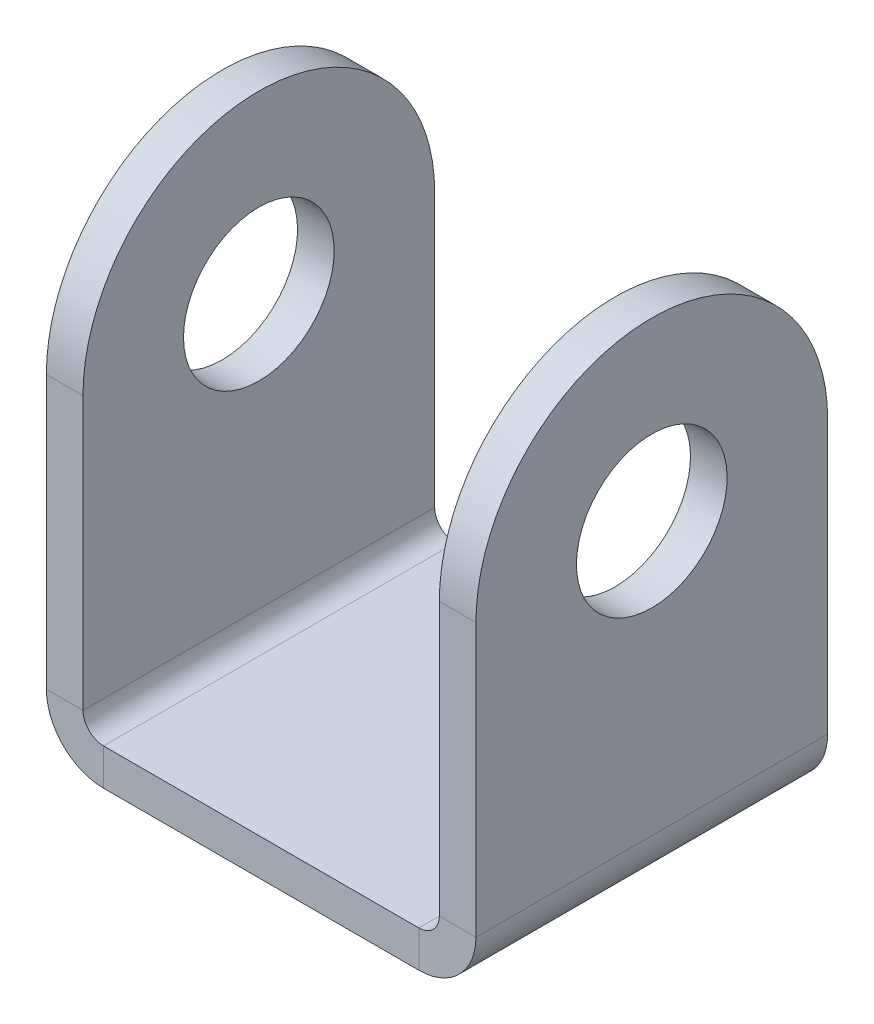
ISO-10303-21;
HEADER;
FILE_DESCRIPTION(('STEP AP214'),'2;1');
FILE_NAME('part.step','',(''),(''),'','','');
FILE_SCHEMA(('AUTOMOTIVE_DESIGN { 1 0 10303 214 1 1 1 1 }'));
ENDSEC;
DATA;
#1=APPLICATION_CONTEXT('core data for automotive mechanical design processes');
#2=APPLICATION_PROTOCOL_DEFINITION('international standard','automotive_design',2000,#1);
#3=PRODUCT_CONTEXT('',#1,'mechanical');
#4=PRODUCT('Part','Part','',(#3));
#5=PRODUCT_RELATED_PRODUCT_CATEGORY('part','',(#4));
#6=PRODUCT_DEFINITION_FORMATION('','',#4);
#7=PRODUCT_DEFINITION_CONTEXT('part definition',#1,'design');
#8=PRODUCT_DEFINITION('design','',#6,#7);
#9=PRODUCT_DEFINITION_SHAPE('','',#8);
#10=(LENGTH_UNIT() NAMED_UNIT(*) SI_UNIT(.MILLI.,.METRE.));
#11=(NAMED_UNIT(*) PLANE_ANGLE_UNIT() SI_UNIT($,.RADIAN.));
#12=(NAMED_UNIT(*) SI_UNIT($,.STERADIAN.) SOLID_ANGLE_UNIT());
#13=UNCERTAINTY_MEASURE_WITH_UNIT(LENGTH_MEASURE(1.E-05),#10,'distance_accuracy_value','');
#14=(GEOMETRIC_REPRESENTATION_CONTEXT(3) GLOBAL_UNCERTAINTY_ASSIGNED_CONTEXT((#13)) GLOBAL_UNIT_ASSIGNED_CONTEXT((#10,
#11,#12)) REPRESENTATION_CONTEXT('',''));
#15=CARTESIAN_POINT('',(0.,0.,0.));
#16=DIRECTION('',(0.,0.,1.));
#17=DIRECTION('',(1.,0.,0.));
#18=AXIS2_PLACEMENT_3D('',#15,#16,#17);
#19=CARTESIAN_POINT('',(-9.3075,0.,0.));
#20=DIRECTION('',(1.,0.,0.));
#21=DIRECTION('',(0.,1.,0.));
#22=AXIS2_PLACEMENT_3D('',#19,#20,#21);
#23=PLANE('',#22);
#24=CARTESIAN_POINT('',(-9.30750000000004,12.7,0.));
#25=DIRECTION('',(-1.,0.,0.));
#26=DIRECTION('',(0.,-1.,0.));
#27=AXIS2_PLACEMENT_3D('',#24,#25,#26);
#28=CIRCLE('',#27,3.2639);
#29=CARTESIAN_POINT('',(-9.30750000000003,9.4361,0.));
#30=VERTEX_POINT('',#29);
#31=EDGE_CURVE('E313',#30,#30,#28,.T.);
#32=ORIENTED_EDGE('',*,*,#31,.F.);
#33=EDGE_LOOP('',(#32));
#34=FACE_BOUND('',#33,.T.);
#35=DIRECTION('',(0.,1.,0.));
#36=VECTOR('',#35,1.);
#37=CARTESIAN_POINT('',(-9.3075,0.,7.61999999999999));
#38=LINE('',#37,#36);
#39=CARTESIAN_POINT('',(-9.3075,0.888999999999992,7.61999999999999));
#40=VERTEX_POINT('',#39);
#41=CARTESIAN_POINT('',(-9.30750000000004,12.7,7.61999999999999));
#42=VERTEX_POINT('',#41);
#43=EDGE_CURVE('E192',#40,#42,#38,.T.);
#44=ORIENTED_EDGE('',*,*,#43,.T.);
#45=CARTESIAN_POINT('',(-9.30750000000004,12.7,0.));
#46=DIRECTION('',(-1.,0.,0.));
#47=DIRECTION('',(0.,-1.,0.));
#48=AXIS2_PLACEMENT_3D('',#45,#46,#47);
#49=CIRCLE('',#48,7.62);
#50=CARTESIAN_POINT('',(-9.30750000000004,12.7,-7.62));
#51=VERTEX_POINT('',#50);
#52=EDGE_CURVE('E176',#51,#42,#49,.F.);
#53=ORIENTED_EDGE('',*,*,#52,.F.);
#54=DIRECTION('',(0.,-1.,0.));
#55=VECTOR('',#54,1.);
#56=CARTESIAN_POINT('',(-9.3075,0.,-7.62));
#57=LINE('',#56,#55);
#58=CARTESIAN_POINT('',(-9.3075,0.888999999999991,-7.62));
#59=VERTEX_POINT('',#58);
#60=EDGE_CURVE('E201',#51,#59,#57,.T.);
#61=ORIENTED_EDGE('',*,*,#60,.T.);
#62=DIRECTION('',(0.,0.,1.));
#63=VECTOR('',#62,1.);
#64=CARTESIAN_POINT('',(-9.3075,0.888999999999991,-7.62));
#65=LINE('',#64,#63);
#66=EDGE_CURVE('E199',#40,#59,#65,.F.);
#67=ORIENTED_EDGE('',*,*,#66,.F.);
#68=EDGE_LOOP('',(#44,#53,#61,#67));
#69=FACE_BOUND('',#68,.T.);
#70=ADVANCED_FACE('F84',(#34,#69),#23,.F.);
#71=CARTESIAN_POINT('',(-7.72,0.,0.));
#72=DIRECTION('',(1.,0.,0.));
#73=DIRECTION('',(0.,1.,0.));
#74=AXIS2_PLACEMENT_3D('',#71,#72,#73);
#75=PLANE('',#74);
#76=CARTESIAN_POINT('',(-7.72000000000004,12.7,0.));
#77=DIRECTION('',(1.,0.,0.));
#78=DIRECTION('',(0.,1.,0.));
#79=AXIS2_PLACEMENT_3D('',#76,#77,#78);
#80=CIRCLE('',#79,3.2639);
#81=CARTESIAN_POINT('',(-7.72000000000005,15.9639,0.));
#82=VERTEX_POINT('',#81);
#83=EDGE_CURVE('E195',#82,#82,#80,.T.);
#84=ORIENTED_EDGE('',*,*,#83,.F.);
#85=EDGE_LOOP('',(#84));
#86=FACE_BOUND('',#85,.T.);
#87=CARTESIAN_POINT('',(-7.72000000000004,12.7,0.));
#88=DIRECTION('',(1.,0.,0.));
#89=DIRECTION('',(0.,1.,0.));
#90=AXIS2_PLACEMENT_3D('',#87,#88,#89);
#91=CIRCLE('',#90,7.62);
#92=CARTESIAN_POINT('',(-7.72000000000004,12.7,7.61999999999999));
#93=VERTEX_POINT('',#92);
#94=CARTESIAN_POINT('',(-7.72000000000007,12.7,-7.62));
#95=VERTEX_POINT('',#94);
#96=EDGE_CURVE('E283',#93,#95,#91,.F.);
#97=ORIENTED_EDGE('',*,*,#96,.F.);
#98=DIRECTION('',(0.,-1.,0.));
#99=VECTOR('',#98,1.);
#100=CARTESIAN_POINT('',(-7.72000000000007,20.32,7.61999999999999));
#101=LINE('',#100,#99);
#102=CARTESIAN_POINT('',(-7.72,0.888999999999997,7.61999999999999));
#103=VERTEX_POINT('',#102);
#104=EDGE_CURVE('E194',#103,#93,#101,.F.);
#105=ORIENTED_EDGE('',*,*,#104,.F.);
#106=DIRECTION('',(0.,0.,1.));
#107=VECTOR('',#106,1.);
#108=CARTESIAN_POINT('',(-7.72,0.888999999999997,-7.62));
#109=LINE('',#108,#107);
#110=CARTESIAN_POINT('',(-7.72,0.888999999999996,-7.62));
#111=VERTEX_POINT('',#110);
#112=EDGE_CURVE('E217',#111,#103,#109,.T.);
#113=ORIENTED_EDGE('',*,*,#112,.F.);
#114=DIRECTION('',(0.,1.,0.));
#115=VECTOR('',#114,1.);
#116=CARTESIAN_POINT('',(-7.72,0.,-7.62));
#117=LINE('',#116,#115);
#118=EDGE_CURVE('E211',#95,#111,#117,.F.);
#119=ORIENTED_EDGE('',*,*,#118,.F.);
#120=EDGE_LOOP('',(#97,#105,#113,#119));
#121=FACE_BOUND('',#120,.T.);
#122=ADVANCED_FACE('F320',(#86,#121),#75,.T.);
#123=CARTESIAN_POINT('',(9.3075,0.,0.));
#124=DIRECTION('',(-1.,0.,0.));
#125=DIRECTION('',(0.,-1.,0.));
#126=AXIS2_PLACEMENT_3D('',#123,#124,#125);
#127=PLANE('',#126);
#128=CARTESIAN_POINT('',(9.30750000000004,12.7000000000001,0.));
#129=DIRECTION('',(-1.,0.,0.));
#130=DIRECTION('',(0.,-1.,0.));
#131=AXIS2_PLACEMENT_3D('',#128,#129,#130);
#132=CIRCLE('',#131,3.2639);
#133=CARTESIAN_POINT('',(9.30750000000003,9.43610000000007,0.));
#134=VERTEX_POINT('',#133);
#135=EDGE_CURVE('E310',#134,#134,#132,.F.);
#136=ORIENTED_EDGE('',*,*,#135,.F.);
#137=EDGE_LOOP('',(#136));
#138=FACE_BOUND('',#137,.T.);
#139=CARTESIAN_POINT('',(9.30750000000004,12.7000000000001,0.));
#140=DIRECTION('',(-1.,0.,0.));
#141=DIRECTION('',(0.,-1.,0.));
#142=AXIS2_PLACEMENT_3D('',#139,#140,#141);
#143=CIRCLE('',#142,7.62);
#144=CARTESIAN_POINT('',(9.30750000000002,12.7000000000001,7.61999999999999));
#145=VERTEX_POINT('',#144);
#146=CARTESIAN_POINT('',(9.30750000000004,12.7000000000001,-7.62));
#147=VERTEX_POINT('',#146);
#148=EDGE_CURVE('E303',#145,#147,#143,.T.);
#149=ORIENTED_EDGE('',*,*,#148,.F.);
#150=DIRECTION('',(0.,-1.,0.));
#151=VECTOR('',#150,1.);
#152=CARTESIAN_POINT('',(9.3075,0.,7.61999999999999));
#153=LINE('',#152,#151);
#154=CARTESIAN_POINT('',(9.3075,0.888999999999991,7.61999999999999));
#155=VERTEX_POINT('',#154);
#156=EDGE_CURVE('E296',#145,#155,#153,.T.);
#157=ORIENTED_EDGE('',*,*,#156,.T.);
#158=DIRECTION('',(0.,0.,-1.));
#159=VECTOR('',#158,1.);
#160=CARTESIAN_POINT('',(9.3075,0.888999999999991,7.61999999999999));
#161=LINE('',#160,#159);
#162=CARTESIAN_POINT('',(9.3075,0.888999999999991,-7.62));
#163=VERTEX_POINT('',#162);
#164=EDGE_CURVE('E288',#163,#155,#161,.F.);
#165=ORIENTED_EDGE('',*,*,#164,.F.);
#166=DIRECTION('',(0.,1.,0.));
#167=VECTOR('',#166,1.);
#168=CARTESIAN_POINT('',(9.3075,0.,-7.62));
#169=LINE('',#168,#167);
#170=EDGE_CURVE('E275',#163,#147,#169,.T.);
#171=ORIENTED_EDGE('',*,*,#170,.T.);
#172=EDGE_LOOP('',(#149,#157,#165,#171));
#173=FACE_BOUND('',#172,.T.);
#174=ADVANCED_FACE('F326',(#138,#173),#127,.F.);
#175=CARTESIAN_POINT('',(7.72,0.,0.));
#176=DIRECTION('',(-1.,0.,0.));
#177=DIRECTION('',(0.,-1.,0.));
#178=AXIS2_PLACEMENT_3D('',#175,#176,#177);
#179=PLANE('',#178);
#180=CARTESIAN_POINT('',(7.72000000000004,12.7000000000001,0.));
#181=DIRECTION('',(-1.,0.,0.));
#182=DIRECTION('',(0.,-1.,0.));
#183=AXIS2_PLACEMENT_3D('',#180,#181,#182);
#184=CIRCLE('',#183,3.2639);
#185=CARTESIAN_POINT('',(7.72000000000003,9.43610000000006,0.));
#186=VERTEX_POINT('',#185);
#187=EDGE_CURVE('E88',#186,#186,#184,.T.);
#188=ORIENTED_EDGE('',*,*,#187,.F.);
#189=EDGE_LOOP('',(#188));
#190=FACE_BOUND('',#189,.T.);
#191=DIRECTION('',(0.,1.,0.));
#192=VECTOR('',#191,1.);
#193=CARTESIAN_POINT('',(7.72,0.,7.61999999999999));
#194=LINE('',#193,#192);
#195=CARTESIAN_POINT('',(7.72000000000004,12.7000000000001,7.61999999999999));
#196=VERTEX_POINT('',#195);
#197=CARTESIAN_POINT('',(7.72,0.888999999999997,7.61999999999999));
#198=VERTEX_POINT('',#197);
#199=EDGE_CURVE('E291',#196,#198,#194,.F.);
#200=ORIENTED_EDGE('',*,*,#199,.F.);
#201=CARTESIAN_POINT('',(7.72000000000004,12.7000000000001,0.));
#202=DIRECTION('',(-1.,0.,0.));
#203=DIRECTION('',(0.,-1.,0.));
#204=AXIS2_PLACEMENT_3D('',#201,#202,#203);
#205=CIRCLE('',#204,7.62);
#206=CARTESIAN_POINT('',(7.72000000000002,12.7000000000001,-7.62));
#207=VERTEX_POINT('',#206);
#208=EDGE_CURVE('E301',#207,#196,#205,.F.);
#209=ORIENTED_EDGE('',*,*,#208,.F.);
#210=DIRECTION('',(0.,-1.,0.));
#211=VECTOR('',#210,1.);
#212=CARTESIAN_POINT('',(7.72000000000007,20.32,-7.62));
#213=LINE('',#212,#211);
#214=CARTESIAN_POINT('',(7.72,0.888999999999997,-7.62));
#215=VERTEX_POINT('',#214);
#216=EDGE_CURVE('E293',#215,#207,#213,.F.);
#217=ORIENTED_EDGE('',*,*,#216,.F.);
#218=DIRECTION('',(0.,0.,-1.));
#219=VECTOR('',#218,1.);
#220=CARTESIAN_POINT('',(7.72,0.888999999999997,7.61999999999999));
#221=LINE('',#220,#219);
#222=EDGE_CURVE('E282',#198,#215,#221,.T.);
#223=ORIENTED_EDGE('',*,*,#222,.F.);
#224=EDGE_LOOP('',(#200,#209,#217,#223));
#225=FACE_BOUND('',#224,.T.);
#226=ADVANCED_FACE('F336',(#190,#225),#179,.T.);
#227=CARTESIAN_POINT('',(-9.30750000000007,20.32,7.61999999999999));
#228=DIRECTION('',(0.,0.,-1.));
#229=DIRECTION('',(-1.,0.,0.));
#230=AXIS2_PLACEMENT_3D('',#227,#228,#229);
#231=PLANE('',#230);
#232=DIRECTION('',(-1.,0.,0.));
#233=VECTOR('',#232,1.);
#234=CARTESIAN_POINT('',(20.083807345283,12.7000000000001,7.61999999999999));
#235=LINE('',#234,#233);
#236=EDGE_CURVE('E179',#93,#42,#235,.T.);
#237=ORIENTED_EDGE('',*,*,#236,.T.);
#238=ORIENTED_EDGE('',*,*,#43,.F.);
#239=DIRECTION('',(1.,0.,0.));
#240=VECTOR('',#239,1.);
#241=CARTESIAN_POINT('',(-7.72,0.888999999999997,7.61999999999999));
#242=LINE('',#241,#240);
#243=EDGE_CURVE('E214',#103,#40,#242,.F.);
#244=ORIENTED_EDGE('',*,*,#243,.F.);
#245=ORIENTED_EDGE('',*,*,#104,.T.);
#246=EDGE_LOOP('',(#237,#238,#244,#245));
#247=FACE_BOUND('',#246,.T.);
#248=ADVANCED_FACE('F190',(#247),#231,.F.);
#249=CARTESIAN_POINT('',(9.3075,0.,7.61999999999999));
#250=DIRECTION('',(0.,0.,-1.));
#251=DIRECTION('',(-1.,0.,0.));
#252=AXIS2_PLACEMENT_3D('',#249,#250,#251);
#253=PLANE('',#252);
#254=EDGE_CURVE('E186',#145,#196,#235,.T.);
#255=ORIENTED_EDGE('',*,*,#254,.T.);
#256=ORIENTED_EDGE('',*,*,#199,.T.);
#257=DIRECTION('',(-1.,0.,0.));
#258=VECTOR('',#257,1.);
#259=CARTESIAN_POINT('',(9.3075,0.888999999999991,7.61999999999999));
#260=LINE('',#259,#258);
#261=EDGE_CURVE('E267',#198,#155,#260,.F.);
#262=ORIENTED_EDGE('',*,*,#261,.T.);
#263=ORIENTED_EDGE('',*,*,#156,.F.);
#264=EDGE_LOOP('',(#255,#256,#262,#263));
#265=FACE_BOUND('',#264,.T.);
#266=ADVANCED_FACE('F335',(#265),#253,.F.);
#267=CARTESIAN_POINT('',(0.,-1.5875,0.));
#268=DIRECTION('',(0.,1.,0.));
#269=DIRECTION('',(0.,0.,1.));
#270=AXIS2_PLACEMENT_3D('',#267,#268,#269);
#271=PLANE('',#270);
#272=DIRECTION('',(0.,0.,-1.));
#273=VECTOR('',#272,1.);
#274=CARTESIAN_POINT('',(6.831,-1.5875,-7.62));
#275=LINE('',#274,#273);
#276=CARTESIAN_POINT('',(6.831,-1.5875,-7.62));
#277=VERTEX_POINT('',#276);
#278=CARTESIAN_POINT('',(6.831,-1.5875,7.61999999999999));
#279=VERTEX_POINT('',#278);
#280=EDGE_CURVE('E271',#277,#279,#275,.F.);
#281=ORIENTED_EDGE('',*,*,#280,.T.);
#282=DIRECTION('',(1.,0.,0.));
#283=VECTOR('',#282,1.);
#284=CARTESIAN_POINT('',(-7.62,-1.5875,7.62));
#285=LINE('',#284,#283);
#286=CARTESIAN_POINT('',(-6.831,-1.5875,7.61999999999999));
#287=VERTEX_POINT('',#286);
#288=EDGE_CURVE('E13',#287,#279,#285,.T.);
#289=ORIENTED_EDGE('',*,*,#288,.F.);
#290=DIRECTION('',(0.,0.,1.));
#291=VECTOR('',#290,1.);
#292=CARTESIAN_POINT('',(-6.831,-1.5875,7.61999999999999));
#293=LINE('',#292,#291);
#294=CARTESIAN_POINT('',(-6.831,-1.5875,-7.62));
#295=VERTEX_POINT('',#294);
#296=EDGE_CURVE('E223',#287,#295,#293,.F.);
#297=ORIENTED_EDGE('',*,*,#296,.T.);
#298=DIRECTION('',(-1.,0.,0.));
#299=VECTOR('',#298,1.);
#300=CARTESIAN_POINT('',(-7.62,-1.5875,-7.62));
#301=LINE('',#300,#299);
#302=EDGE_CURVE('E93',#277,#295,#301,.T.);
#303=ORIENTED_EDGE('',*,*,#302,.F.);
#304=EDGE_LOOP('',(#281,#289,#297,#303));
#305=FACE_BOUND('',#304,.T.);
#306=ADVANCED_FACE('F358',(#305),#271,.F.);
#307=CARTESIAN_POINT('',(0.,0.,0.));
#308=DIRECTION('',(0.,1.,0.));
#309=DIRECTION('',(0.,0.,1.));
#310=AXIS2_PLACEMENT_3D('',#307,#308,#309);
#311=PLANE('',#310);
#312=DIRECTION('',(1.,0.,0.));
#313=VECTOR('',#312,1.);
#314=CARTESIAN_POINT('',(-7.62,0.,7.62));
#315=LINE('',#314,#313);
#316=CARTESIAN_POINT('',(-6.831,0.,7.62));
#317=VERTEX_POINT('',#316);
#318=CARTESIAN_POINT('',(6.831,0.,7.61999999999999));
#319=VERTEX_POINT('',#318);
#320=EDGE_CURVE('E242',#317,#319,#315,.T.);
#321=ORIENTED_EDGE('',*,*,#320,.T.);
#322=DIRECTION('',(0.,0.,-1.));
#323=VECTOR('',#322,1.);
#324=CARTESIAN_POINT('',(6.831,0.,-7.62));
#325=LINE('',#324,#323);
#326=CARTESIAN_POINT('',(6.831,0.,-7.62));
#327=VERTEX_POINT('',#326);
#328=EDGE_CURVE('E246',#327,#319,#325,.F.);
#329=ORIENTED_EDGE('',*,*,#328,.F.);
#330=DIRECTION('',(-1.,0.,0.));
#331=VECTOR('',#330,1.);
#332=CARTESIAN_POINT('',(-7.62,0.,-7.62));
#333=LINE('',#332,#331);
#334=CARTESIAN_POINT('',(-6.831,0.,-7.62));
#335=VERTEX_POINT('',#334);
#336=EDGE_CURVE('E239',#327,#335,#333,.T.);
#337=ORIENTED_EDGE('',*,*,#336,.T.);
#338=DIRECTION('',(0.,0.,1.));
#339=VECTOR('',#338,1.);
#340=CARTESIAN_POINT('',(-6.831,0.,7.61999999999999));
#341=LINE('',#340,#339);
#342=EDGE_CURVE('E101',#317,#335,#341,.F.);
#343=ORIENTED_EDGE('',*,*,#342,.F.);
#344=EDGE_LOOP('',(#321,#329,#337,#343));
#345=FACE_BOUND('',#344,.T.);
#346=ADVANCED_FACE('F245',(#345),#311,.T.);
#347=CARTESIAN_POINT('',(-7.62,-1.5875,-7.62));
#348=DIRECTION('',(0.,0.,-1.));
#349=DIRECTION('',(-1.,0.,0.));
#350=AXIS2_PLACEMENT_3D('',#347,#348,#349);
#351=PLANE('',#350);
#352=ORIENTED_EDGE('',*,*,#336,.F.);
#353=DIRECTION('',(0.,-1.,0.));
#354=VECTOR('',#353,1.);
#355=CARTESIAN_POINT('',(6.831,0.,-7.62));
#356=LINE('',#355,#354);
#357=EDGE_CURVE('E207',#327,#277,#356,.T.);
#358=ORIENTED_EDGE('',*,*,#357,.T.);
#359=ORIENTED_EDGE('',*,*,#302,.T.);
#360=DIRECTION('',(0.,-1.,0.));
#361=VECTOR('',#360,1.);
#362=CARTESIAN_POINT('',(-6.831,0.,-7.62));
#363=LINE('',#362,#361);
#364=EDGE_CURVE('E236',#335,#295,#363,.T.);
#365=ORIENTED_EDGE('',*,*,#364,.F.);
#366=EDGE_LOOP('',(#352,#358,#359,#365));
#367=FACE_BOUND('',#366,.T.);
#368=ADVANCED_FACE('F86',(#367),#351,.T.);
#369=CARTESIAN_POINT('',(-7.62,-1.5875,7.62));
#370=DIRECTION('',(0.,0.,1.));
#371=DIRECTION('',(1.,0.,0.));
#372=AXIS2_PLACEMENT_3D('',#369,#370,#371);
#373=PLANE('',#372);
#374=DIRECTION('',(0.,-1.,0.));
#375=VECTOR('',#374,1.);
#376=CARTESIAN_POINT('',(6.831,0.,7.61999999999999));
#377=LINE('',#376,#375);
#378=EDGE_CURVE('E222',#319,#279,#377,.T.);
#379=ORIENTED_EDGE('',*,*,#378,.F.);
#380=ORIENTED_EDGE('',*,*,#320,.F.);
#381=DIRECTION('',(0.,-1.,0.));
#382=VECTOR('',#381,1.);
#383=CARTESIAN_POINT('',(-6.831,0.,7.61999999999999));
#384=LINE('',#383,#382);
#385=EDGE_CURVE('E229',#317,#287,#384,.T.);
#386=ORIENTED_EDGE('',*,*,#385,.T.);
#387=ORIENTED_EDGE('',*,*,#288,.T.);
#388=EDGE_LOOP('',(#379,#380,#386,#387));
#389=FACE_BOUND('',#388,.T.);
#390=ADVANCED_FACE('F353',(#389),#373,.T.);
#391=CARTESIAN_POINT('',(-6.831,0.889,-7.62));
#392=DIRECTION('',(0.,0.,-1.));
#393=DIRECTION('',(0.,1.,0.));
#394=AXIS2_PLACEMENT_3D('',#391,#392,#393);
#395=PLANE('',#394);
#396=DIRECTION('',(1.,0.,0.));
#397=VECTOR('',#396,1.);
#398=CARTESIAN_POINT('',(-9.3075,0.888999999999991,-7.62));
#399=LINE('',#398,#397);
#400=EDGE_CURVE('E219',#111,#59,#399,.F.);
#401=ORIENTED_EDGE('',*,*,#400,.F.);
#402=CARTESIAN_POINT('',(-6.831,0.889,-7.62));
#403=DIRECTION('',(0.,0.,1.));
#404=DIRECTION('',(0.,-1.,0.));
#405=AXIS2_PLACEMENT_3D('',#402,#403,#404);
#406=CIRCLE('',#405,0.889000000000001);
#407=EDGE_CURVE('E232',#335,#111,#406,.F.);
#408=ORIENTED_EDGE('',*,*,#407,.F.);
#409=ORIENTED_EDGE('',*,*,#364,.T.);
#410=CARTESIAN_POINT('',(-6.831,0.889,-7.62));
#411=DIRECTION('',(0.,0.,1.));
#412=DIRECTION('',(0.,-1.,0.));
#413=AXIS2_PLACEMENT_3D('',#410,#411,#412);
#414=CIRCLE('',#413,2.4765);
#415=EDGE_CURVE('E225',#295,#59,#414,.F.);
#416=ORIENTED_EDGE('',*,*,#415,.T.);
#417=EDGE_LOOP('',(#401,#408,#409,#416));
#418=FACE_BOUND('',#417,.T.);
#419=ADVANCED_FACE('F350',(#418),#395,.T.);
#420=CARTESIAN_POINT('',(-6.831,0.889000000000001,7.61999999999999));
#421=DIRECTION('',(0.,0.,-1.));
#422=DIRECTION('',(0.,1.,0.));
#423=AXIS2_PLACEMENT_3D('',#420,#421,#422);
#424=PLANE('',#423);
#425=CARTESIAN_POINT('',(-6.831,0.889000000000001,7.61999999999999));
#426=DIRECTION('',(0.,0.,1.));
#427=DIRECTION('',(0.,-1.,0.));
#428=AXIS2_PLACEMENT_3D('',#425,#426,#427);
#429=CIRCLE('',#428,0.889000000000001);
#430=EDGE_CURVE('E200',#103,#317,#429,.T.);
#431=ORIENTED_EDGE('',*,*,#430,.F.);
#432=ORIENTED_EDGE('',*,*,#243,.T.);
#433=CARTESIAN_POINT('',(-6.831,0.889000000000001,7.61999999999999));
#434=DIRECTION('',(0.,0.,1.));
#435=DIRECTION('',(0.,-1.,0.));
#436=AXIS2_PLACEMENT_3D('',#433,#434,#435);
#437=CIRCLE('',#436,2.4765);
#438=EDGE_CURVE('E226',#40,#287,#437,.T.);
#439=ORIENTED_EDGE('',*,*,#438,.T.);
#440=ORIENTED_EDGE('',*,*,#385,.F.);
#441=EDGE_LOOP('',(#431,#432,#439,#440));
#442=FACE_BOUND('',#441,.T.);
#443=ADVANCED_FACE('F345',(#442),#424,.F.);
#444=CARTESIAN_POINT('',(-6.831,0.889000000000001,7.61999999999999));
#445=DIRECTION('',(0.,0.,1.));
#446=DIRECTION('',(-1.,0.,0.));
#447=AXIS2_PLACEMENT_3D('',#444,#445,#446);
#448=CYLINDRICAL_SURFACE('',#447,2.4765);
#449=ORIENTED_EDGE('',*,*,#296,.F.);
#450=ORIENTED_EDGE('',*,*,#438,.F.);
#451=ORIENTED_EDGE('',*,*,#66,.T.);
#452=ORIENTED_EDGE('',*,*,#415,.F.);
#453=EDGE_LOOP('',(#449,#450,#451,#452));
#454=FACE_BOUND('',#453,.T.);
#455=ADVANCED_FACE('F342',(#454),#448,.T.);
#456=CARTESIAN_POINT('',(-6.831,0.889000000000001,7.61999999999999));
#457=DIRECTION('',(0.,0.,1.));
#458=DIRECTION('',(-1.,0.,0.));
#459=AXIS2_PLACEMENT_3D('',#456,#457,#458);
#460=CYLINDRICAL_SURFACE('',#459,0.889000000000001);
#461=ORIENTED_EDGE('',*,*,#342,.T.);
#462=ORIENTED_EDGE('',*,*,#407,.T.);
#463=ORIENTED_EDGE('',*,*,#112,.T.);
#464=ORIENTED_EDGE('',*,*,#430,.T.);
#465=EDGE_LOOP('',(#461,#462,#463,#464));
#466=FACE_BOUND('',#465,.T.);
#467=ADVANCED_FACE('F340',(#466),#460,.F.);
#468=CARTESIAN_POINT('',(-9.3075,0.,-7.62));
#469=DIRECTION('',(0.,0.,1.));
#470=DIRECTION('',(1.,0.,0.));
#471=AXIS2_PLACEMENT_3D('',#468,#469,#470);
#472=PLANE('',#471);
#473=ORIENTED_EDGE('',*,*,#60,.F.);
#474=DIRECTION('',(-1.,0.,0.));
#475=VECTOR('',#474,1.);
#476=CARTESIAN_POINT('',(20.083807345283,12.7000000000001,-7.62));
#477=LINE('',#476,#475);
#478=EDGE_CURVE('E182',#95,#51,#477,.T.);
#479=ORIENTED_EDGE('',*,*,#478,.F.);
#480=ORIENTED_EDGE('',*,*,#118,.T.);
#481=ORIENTED_EDGE('',*,*,#400,.T.);
#482=EDGE_LOOP('',(#473,#479,#480,#481));
#483=FACE_BOUND('',#482,.T.);
#484=ADVANCED_FACE('F337',(#483),#472,.F.);
#485=CARTESIAN_POINT('',(6.831,0.889,7.61999999999999));
#486=DIRECTION('',(0.,0.,1.));
#487=DIRECTION('',(1.,0.,0.));
#488=AXIS2_PLACEMENT_3D('',#485,#486,#487);
#489=PLANE('',#488);
#490=ORIENTED_EDGE('',*,*,#261,.F.);
#491=CARTESIAN_POINT('',(6.831,0.889,7.61999999999999));
#492=DIRECTION('',(0.,0.,-1.));
#493=DIRECTION('',(-1.,0.,0.));
#494=AXIS2_PLACEMENT_3D('',#491,#492,#493);
#495=CIRCLE('',#494,0.889000000000001);
#496=EDGE_CURVE('E255',#319,#198,#495,.F.);
#497=ORIENTED_EDGE('',*,*,#496,.F.);
#498=ORIENTED_EDGE('',*,*,#378,.T.);
#499=CARTESIAN_POINT('',(6.831,0.889,7.61999999999999));
#500=DIRECTION('',(0.,0.,-1.));
#501=DIRECTION('',(-1.,0.,0.));
#502=AXIS2_PLACEMENT_3D('',#499,#500,#501);
#503=CIRCLE('',#502,2.4765);
#504=EDGE_CURVE('E276',#279,#155,#503,.F.);
#505=ORIENTED_EDGE('',*,*,#504,.T.);
#506=EDGE_LOOP('',(#490,#497,#498,#505));
#507=FACE_BOUND('',#506,.T.);
#508=ADVANCED_FACE('F263',(#507),#489,.T.);
#509=CARTESIAN_POINT('',(6.831,0.889,-7.62));
#510=DIRECTION('',(0.,0.,1.));
#511=DIRECTION('',(1.,0.,0.));
#512=AXIS2_PLACEMENT_3D('',#509,#510,#511);
#513=PLANE('',#512);
#514=CARTESIAN_POINT('',(6.831,0.889,-7.62));
#515=DIRECTION('',(0.,0.,-1.));
#516=DIRECTION('',(-1.,0.,0.));
#517=AXIS2_PLACEMENT_3D('',#514,#515,#516);
#518=CIRCLE('',#517,0.889000000000001);
#519=EDGE_CURVE('E258',#215,#327,#518,.T.);
#520=ORIENTED_EDGE('',*,*,#519,.F.);
#521=DIRECTION('',(-1.,0.,0.));
#522=VECTOR('',#521,1.);
#523=CARTESIAN_POINT('',(7.72,0.888999999999997,-7.62));
#524=LINE('',#523,#522);
#525=EDGE_CURVE('E285',#215,#163,#524,.F.);
#526=ORIENTED_EDGE('',*,*,#525,.T.);
#527=CARTESIAN_POINT('',(6.831,0.889,-7.62));
#528=DIRECTION('',(0.,0.,-1.));
#529=DIRECTION('',(-1.,0.,0.));
#530=AXIS2_PLACEMENT_3D('',#527,#528,#529);
#531=CIRCLE('',#530,2.4765);
#532=EDGE_CURVE('E268',#163,#277,#531,.T.);
#533=ORIENTED_EDGE('',*,*,#532,.T.);
#534=ORIENTED_EDGE('',*,*,#357,.F.);
#535=EDGE_LOOP('',(#520,#526,#533,#534));
#536=FACE_BOUND('',#535,.T.);
#537=ADVANCED_FACE('F330',(#536),#513,.F.);
#538=CARTESIAN_POINT('',(6.831,0.889,-7.62));
#539=DIRECTION('',(0.,0.,-1.));
#540=DIRECTION('',(1.,0.,0.));
#541=AXIS2_PLACEMENT_3D('',#538,#539,#540);
#542=CYLINDRICAL_SURFACE('',#541,2.4765);
#543=ORIENTED_EDGE('',*,*,#280,.F.);
#544=ORIENTED_EDGE('',*,*,#532,.F.);
#545=ORIENTED_EDGE('',*,*,#164,.T.);
#546=ORIENTED_EDGE('',*,*,#504,.F.);
#547=EDGE_LOOP('',(#543,#544,#545,#546));
#548=FACE_BOUND('',#547,.T.);
#549=ADVANCED_FACE('F369',(#548),#542,.T.);
#550=CARTESIAN_POINT('',(6.831,0.889,-7.62));
#551=DIRECTION('',(0.,0.,-1.));
#552=DIRECTION('',(1.,0.,0.));
#553=AXIS2_PLACEMENT_3D('',#550,#551,#552);
#554=CYLINDRICAL_SURFACE('',#553,0.889000000000001);
#555=ORIENTED_EDGE('',*,*,#328,.T.);
#556=ORIENTED_EDGE('',*,*,#496,.T.);
#557=ORIENTED_EDGE('',*,*,#222,.T.);
#558=ORIENTED_EDGE('',*,*,#519,.T.);
#559=EDGE_LOOP('',(#555,#556,#557,#558));
#560=FACE_BOUND('',#559,.T.);
#561=ADVANCED_FACE('F254',(#560),#554,.F.);
#562=CARTESIAN_POINT('',(9.30750000000007,20.32,-7.62));
#563=DIRECTION('',(0.,0.,1.));
#564=DIRECTION('',(1.,0.,0.));
#565=AXIS2_PLACEMENT_3D('',#562,#563,#564);
#566=PLANE('',#565);
#567=ORIENTED_EDGE('',*,*,#216,.T.);
#568=EDGE_CURVE('E305',#147,#207,#477,.T.);
#569=ORIENTED_EDGE('',*,*,#568,.F.);
#570=ORIENTED_EDGE('',*,*,#170,.F.);
#571=ORIENTED_EDGE('',*,*,#525,.F.);
#572=EDGE_LOOP('',(#567,#569,#570,#571));
#573=FACE_BOUND('',#572,.T.);
#574=ADVANCED_FACE('F379',(#573),#566,.F.);
#575=CARTESIAN_POINT('',(20.083807345283,12.7000000000001,0.));
#576=DIRECTION('',(-1.,0.,0.));
#577=DIRECTION('',(0.,-1.,0.));
#578=AXIS2_PLACEMENT_3D('',#575,#576,#577);
#579=CYLINDRICAL_SURFACE('',#578,7.62);
#580=ORIENTED_EDGE('',*,*,#208,.T.);
#581=ORIENTED_EDGE('',*,*,#254,.F.);
#582=ORIENTED_EDGE('',*,*,#148,.T.);
#583=ORIENTED_EDGE('',*,*,#568,.T.);
#584=EDGE_LOOP('',(#580,#581,#582,#583));
#585=FACE_BOUND('',#584,.T.);
#586=ADVANCED_FACE('F382',(#585),#579,.T.);
#587=ORIENTED_EDGE('',*,*,#96,.T.);
#588=ORIENTED_EDGE('',*,*,#478,.T.);
#589=ORIENTED_EDGE('',*,*,#52,.T.);
#590=ORIENTED_EDGE('',*,*,#236,.F.);
#591=EDGE_LOOP('',(#587,#588,#589,#590));
#592=FACE_BOUND('',#591,.T.);
#593=ADVANCED_FACE('F178',(#592),#579,.T.);
#594=CARTESIAN_POINT('',(18.5392032924591,12.7000000000001,0.));
#595=DIRECTION('',(-1.,0.,0.));
#596=DIRECTION('',(0.,-1.,0.));
#597=AXIS2_PLACEMENT_3D('',#594,#595,#596);
#598=CYLINDRICAL_SURFACE('',#597,3.2639);
#599=ORIENTED_EDGE('',*,*,#187,.T.);
#600=EDGE_LOOP('',(#599));
#601=FACE_BOUND('',#600,.T.);
#602=ORIENTED_EDGE('',*,*,#135,.T.);
#603=EDGE_LOOP('',(#602));
#604=FACE_BOUND('',#603,.T.);
#605=ADVANCED_FACE('F461',(#601,#604),#598,.F.);
#606=ORIENTED_EDGE('',*,*,#83,.T.);
#607=EDGE_LOOP('',(#606));
#608=FACE_BOUND('',#607,.T.);
#609=ORIENTED_EDGE('',*,*,#31,.T.);
#610=EDGE_LOOP('',(#609));
#611=FACE_BOUND('',#610,.T.);
#612=ADVANCED_FACE('F317',(#608,#611),#598,.F.);
#613=CLOSED_SHELL('',(#70,#122,#174,#226,#248,#266,#306,#346,#368,#390,#419,#443,#455,#467,#484,
#508,#537,#549,#561,#574,#586,#593,#605,#612));
#614=MANIFOLD_SOLID_BREP('B2',#613);
#615=ADVANCED_BREP_SHAPE_REPRESENTATION('',(#18,#614),#14);
#616=SHAPE_DEFINITION_REPRESENTATION(#9,#615);
ENDSEC;
END-ISO-10303-21;
